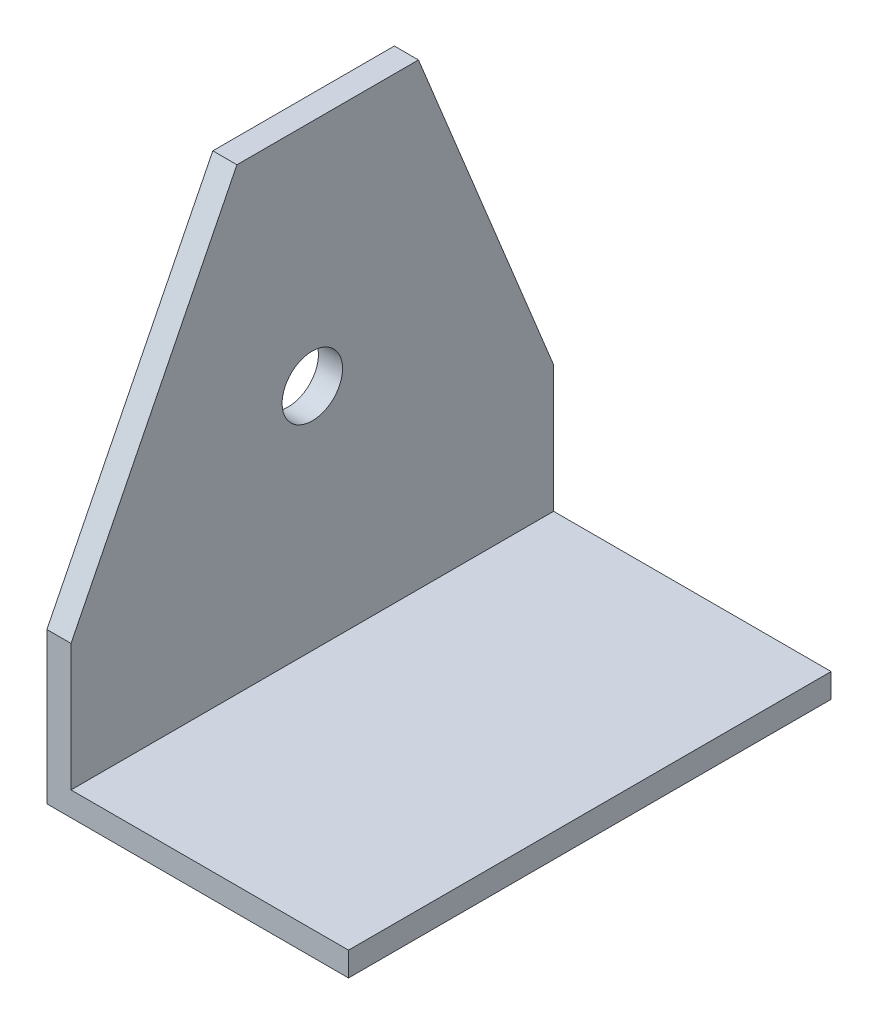
ISO-10303-21;
HEADER;
FILE_DESCRIPTION(('STEP AP214'),'2;1');
FILE_NAME('part.step','',(''),(''),'','','');
FILE_SCHEMA(('AUTOMOTIVE_DESIGN { 1 0 10303 214 1 1 1 1 }'));
ENDSEC;
DATA;
#1=APPLICATION_CONTEXT('core data for automotive mechanical design processes');
#2=APPLICATION_PROTOCOL_DEFINITION('international standard','automotive_design',2000,#1);
#3=PRODUCT_CONTEXT('',#1,'mechanical');
#4=PRODUCT('Part','Part','',(#3));
#5=PRODUCT_RELATED_PRODUCT_CATEGORY('part','',(#4));
#6=PRODUCT_DEFINITION_FORMATION('','',#4);
#7=PRODUCT_DEFINITION_CONTEXT('part definition',#1,'design');
#8=PRODUCT_DEFINITION('design','',#6,#7);
#9=PRODUCT_DEFINITION_SHAPE('','',#8);
#10=(LENGTH_UNIT() NAMED_UNIT(*) SI_UNIT(.MILLI.,.METRE.));
#11=(NAMED_UNIT(*) PLANE_ANGLE_UNIT() SI_UNIT($,.RADIAN.));
#12=(NAMED_UNIT(*) SI_UNIT($,.STERADIAN.) SOLID_ANGLE_UNIT());
#13=UNCERTAINTY_MEASURE_WITH_UNIT(LENGTH_MEASURE(1.E-05),#10,'distance_accuracy_value','');
#14=(GEOMETRIC_REPRESENTATION_CONTEXT(3) GLOBAL_UNCERTAINTY_ASSIGNED_CONTEXT((#13)) GLOBAL_UNIT_ASSIGNED_CONTEXT((#10,
#11,#12)) REPRESENTATION_CONTEXT('',''));
#15=CARTESIAN_POINT('',(0.,0.,0.));
#16=DIRECTION('',(0.,0.,1.));
#17=DIRECTION('',(1.,0.,0.));
#18=AXIS2_PLACEMENT_3D('',#15,#16,#17);
#19=CARTESIAN_POINT('',(-38.9135225375626,50.6999999999999,80.));
#20=DIRECTION('',(0.,-1.,0.));
#21=DIRECTION('',(0.,0.,-1.));
#22=AXIS2_PLACEMENT_3D('',#19,#20,#21);
#23=PLANE('',#22);
#24=DIRECTION('',(0.,0.,-1.));
#25=VECTOR('',#24,1.);
#26=CARTESIAN_POINT('',(-38.9135225375626,50.6999999999999,80.));
#27=LINE('',#26,#25);
#28=CARTESIAN_POINT('',(-38.9135225375626,50.6999999999999,52.4980270810016));
#29=VERTEX_POINT('',#28);
#30=CARTESIAN_POINT('',(-38.9135225375626,50.6999999999999,22.4007373757324));
#31=VERTEX_POINT('',#30);
#32=EDGE_CURVE('E114',#29,#31,#27,.T.);
#33=ORIENTED_EDGE('',*,*,#32,.T.);
#34=DIRECTION('',(1.,0.,0.));
#35=VECTOR('',#34,1.);
#36=CARTESIAN_POINT('',(-80.,50.6999999999999,22.4007373757324));
#37=LINE('',#36,#35);
#38=CARTESIAN_POINT('',(-42.9135225375626,50.6999999999999,22.4007373757324));
#39=VERTEX_POINT('',#38);
#40=EDGE_CURVE('E102',#39,#31,#37,.T.);
#41=ORIENTED_EDGE('',*,*,#40,.F.);
#42=DIRECTION('',(0.,0.,-1.));
#43=VECTOR('',#42,1.);
#44=CARTESIAN_POINT('',(-42.9135225375626,50.6999999999999,80.));
#45=LINE('',#44,#43);
#46=CARTESIAN_POINT('',(-42.9135225375626,50.6999999999999,52.4980270810016));
#47=VERTEX_POINT('',#46);
#48=EDGE_CURVE('E112',#47,#39,#45,.T.);
#49=ORIENTED_EDGE('',*,*,#48,.F.);
#50=DIRECTION('',(1.,0.,0.));
#51=VECTOR('',#50,1.);
#52=CARTESIAN_POINT('',(-80.,50.6999999999999,52.4980270810016));
#53=LINE('',#52,#51);
#54=EDGE_CURVE('E106',#47,#29,#53,.T.);
#55=ORIENTED_EDGE('',*,*,#54,.T.);
#56=EDGE_LOOP('',(#33,#41,#49,#55));
#57=FACE_BOUND('',#56,.T.);
#58=ADVANCED_FACE('F38',(#57),#23,.F.);
#59=CARTESIAN_POINT('',(-42.9135225375626,50.6999999999999,80.));
#60=DIRECTION('',(1.,0.,0.));
#61=DIRECTION('',(0.,0.,-1.));
#62=AXIS2_PLACEMENT_3D('',#59,#60,#61);
#63=PLANE('',#62);
#64=CARTESIAN_POINT('',(-42.9135225375626,12.6999999999999,40.));
#65=DIRECTION('',(1.,0.,0.));
#66=DIRECTION('',(0.,0.,-1.));
#67=AXIS2_PLACEMENT_3D('',#64,#65,#66);
#68=CIRCLE('',#67,5.0115);
#69=CARTESIAN_POINT('',(-42.9135225375626,12.6999999999999,34.9885));
#70=VERTEX_POINT('',#69);
#71=EDGE_CURVE('E146',#70,#70,#68,.T.);
#72=ORIENTED_EDGE('',*,*,#71,.T.);
#73=EDGE_LOOP('',(#72));
#74=FACE_BOUND('',#73,.T.);
#75=ORIENTED_EDGE('',*,*,#48,.T.);
#76=DIRECTION('',(0.,-0.926052875939042,-0.377393787660885));
#77=VECTOR('',#76,1.);
#78=CARTESIAN_POINT('',(-42.9135225375626,70.8301705967342,30.6043740417897));
#79=LINE('',#78,#77);
#80=CARTESIAN_POINT('',(-42.9135225375626,-4.26716678492981,0.));
#81=VERTEX_POINT('',#80);
#82=EDGE_CURVE('E99',#39,#81,#79,.T.);
#83=ORIENTED_EDGE('',*,*,#82,.T.);
#84=DIRECTION('',(0.,-1.,0.));
#85=VECTOR('',#84,1.);
#86=CARTESIAN_POINT('',(-42.9135225375626,50.6999999999999,0.));
#87=LINE('',#86,#85);
#88=CARTESIAN_POINT('',(-42.9135225375626,-29.3000000000001,0.));
#89=VERTEX_POINT('',#88);
#90=EDGE_CURVE('E144',#81,#89,#87,.T.);
#91=ORIENTED_EDGE('',*,*,#90,.T.);
#92=DIRECTION('',(0.,0.,-1.));
#93=VECTOR('',#92,1.);
#94=CARTESIAN_POINT('',(-42.9135225375626,-29.3000000000001,80.));
#95=LINE('',#94,#93);
#96=CARTESIAN_POINT('',(-42.9135225375626,-29.3000000000001,80.));
#97=VERTEX_POINT('',#96);
#98=EDGE_CURVE('E118',#97,#89,#95,.T.);
#99=ORIENTED_EDGE('',*,*,#98,.F.);
#100=DIRECTION('',(0.,-1.,0.));
#101=VECTOR('',#100,1.);
#102=CARTESIAN_POINT('',(-42.9135225375626,50.6999999999999,80.));
#103=LINE('',#102,#101);
#104=CARTESIAN_POINT('',(-42.9135225375626,-4.26716678492981,80.));
#105=VERTEX_POINT('',#104);
#106=EDGE_CURVE('E137',#105,#97,#103,.T.);
#107=ORIENTED_EDGE('',*,*,#106,.F.);
#108=DIRECTION('',(0.,0.894307481048207,-0.447452935336457));
#109=VECTOR('',#108,1.);
#110=CARTESIAN_POINT('',(-42.9135225375626,39.6947965598021,58.0043106441445));
#111=LINE('',#110,#109);
#112=EDGE_CURVE('E59',#105,#47,#111,.T.);
#113=ORIENTED_EDGE('',*,*,#112,.T.);
#114=EDGE_LOOP('',(#75,#83,#91,#99,#107,#113));
#115=FACE_BOUND('',#114,.T.);
#116=ADVANCED_FACE('F116',(#74,#115),#63,.F.);
#117=CARTESIAN_POINT('',(-42.9135225375626,-29.3000000000001,80.));
#118=DIRECTION('',(0.,1.,0.));
#119=DIRECTION('',(0.,0.,1.));
#120=AXIS2_PLACEMENT_3D('',#117,#118,#119);
#121=PLANE('',#120);
#122=DIRECTION('',(1.,0.,0.));
#123=VECTOR('',#122,1.);
#124=CARTESIAN_POINT('',(-42.9135225375626,-29.3000000000001,0.));
#125=LINE('',#124,#123);
#126=CARTESIAN_POINT('',(7.08647746243741,-29.3000000000001,0.));
#127=VERTEX_POINT('',#126);
#128=EDGE_CURVE('E142',#89,#127,#125,.T.);
#129=ORIENTED_EDGE('',*,*,#128,.T.);
#130=DIRECTION('',(0.,0.,-1.));
#131=VECTOR('',#130,1.);
#132=CARTESIAN_POINT('',(7.08647746243741,-29.3000000000001,80.));
#133=LINE('',#132,#131);
#134=CARTESIAN_POINT('',(7.08647746243741,-29.3000000000001,80.));
#135=VERTEX_POINT('',#134);
#136=EDGE_CURVE('E121',#135,#127,#133,.T.);
#137=ORIENTED_EDGE('',*,*,#136,.F.);
#138=DIRECTION('',(1.,0.,0.));
#139=VECTOR('',#138,1.);
#140=CARTESIAN_POINT('',(-42.9135225375626,-29.3000000000001,80.));
#141=LINE('',#140,#139);
#142=EDGE_CURVE('E153',#97,#135,#141,.T.);
#143=ORIENTED_EDGE('',*,*,#142,.F.);
#144=ORIENTED_EDGE('',*,*,#98,.T.);
#145=EDGE_LOOP('',(#129,#137,#143,#144));
#146=FACE_BOUND('',#145,.T.);
#147=ADVANCED_FACE('F179',(#146),#121,.F.);
#148=CARTESIAN_POINT('',(7.08647746243741,-29.3000000000001,80.));
#149=DIRECTION('',(-1.,0.,0.));
#150=DIRECTION('',(0.,0.,1.));
#151=AXIS2_PLACEMENT_3D('',#148,#149,#150);
#152=PLANE('',#151);
#153=DIRECTION('',(0.,1.,0.));
#154=VECTOR('',#153,1.);
#155=CARTESIAN_POINT('',(7.08647746243741,-29.3000000000001,0.));
#156=LINE('',#155,#154);
#157=CARTESIAN_POINT('',(7.08647746243741,-25.3000000000001,0.));
#158=VERTEX_POINT('',#157);
#159=EDGE_CURVE('E140',#127,#158,#156,.T.);
#160=ORIENTED_EDGE('',*,*,#159,.T.);
#161=DIRECTION('',(0.,0.,-1.));
#162=VECTOR('',#161,1.);
#163=CARTESIAN_POINT('',(7.08647746243741,-25.3000000000001,80.));
#164=LINE('',#163,#162);
#165=CARTESIAN_POINT('',(7.08647746243741,-25.3000000000001,80.));
#166=VERTEX_POINT('',#165);
#167=EDGE_CURVE('E126',#166,#158,#164,.T.);
#168=ORIENTED_EDGE('',*,*,#167,.F.);
#169=DIRECTION('',(0.,1.,0.));
#170=VECTOR('',#169,1.);
#171=CARTESIAN_POINT('',(7.08647746243741,-29.3000000000001,80.));
#172=LINE('',#171,#170);
#173=EDGE_CURVE('E151',#135,#166,#172,.T.);
#174=ORIENTED_EDGE('',*,*,#173,.F.);
#175=ORIENTED_EDGE('',*,*,#136,.T.);
#176=EDGE_LOOP('',(#160,#168,#174,#175));
#177=FACE_BOUND('',#176,.T.);
#178=ADVANCED_FACE('F204',(#177),#152,.F.);
#179=CARTESIAN_POINT('',(7.08647746243741,-25.3000000000001,80.));
#180=DIRECTION('',(0.,-1.,0.));
#181=DIRECTION('',(1.,0.,0.));
#182=AXIS2_PLACEMENT_3D('',#179,#180,#181);
#183=PLANE('',#182);
#184=DIRECTION('',(-1.,0.,0.));
#185=VECTOR('',#184,1.);
#186=CARTESIAN_POINT('',(7.08647746243741,-25.3000000000001,0.));
#187=LINE('',#186,#185);
#188=CARTESIAN_POINT('',(-38.9135225375626,-25.3000000000001,0.));
#189=VERTEX_POINT('',#188);
#190=EDGE_CURVE('E138',#158,#189,#187,.T.);
#191=ORIENTED_EDGE('',*,*,#190,.T.);
#192=DIRECTION('',(0.,0.,-1.));
#193=VECTOR('',#192,1.);
#194=CARTESIAN_POINT('',(-38.9135225375626,-25.3000000000001,80.));
#195=LINE('',#194,#193);
#196=CARTESIAN_POINT('',(-38.9135225375626,-25.3000000000001,80.));
#197=VERTEX_POINT('',#196);
#198=EDGE_CURVE('E129',#197,#189,#195,.T.);
#199=ORIENTED_EDGE('',*,*,#198,.F.);
#200=DIRECTION('',(-1.,0.,0.));
#201=VECTOR('',#200,1.);
#202=CARTESIAN_POINT('',(7.08647746243741,-25.3000000000001,80.));
#203=LINE('',#202,#201);
#204=EDGE_CURVE('E149',#166,#197,#203,.T.);
#205=ORIENTED_EDGE('',*,*,#204,.F.);
#206=ORIENTED_EDGE('',*,*,#167,.T.);
#207=EDGE_LOOP('',(#191,#199,#205,#206));
#208=FACE_BOUND('',#207,.T.);
#209=ADVANCED_FACE('F209',(#208),#183,.F.);
#210=CARTESIAN_POINT('',(-38.9135225375626,-25.3000000000001,80.));
#211=DIRECTION('',(-1.,0.,0.));
#212=DIRECTION('',(0.,-1.,0.));
#213=AXIS2_PLACEMENT_3D('',#210,#211,#212);
#214=PLANE('',#213);
#215=CARTESIAN_POINT('',(-38.9135225375626,12.6999999999999,40.));
#216=DIRECTION('',(1.,0.,0.));
#217=DIRECTION('',(0.,1.,0.));
#218=AXIS2_PLACEMENT_3D('',#215,#216,#217);
#219=CIRCLE('',#218,5.0115);
#220=CARTESIAN_POINT('',(-38.9135225375626,17.7114999999999,40.));
#221=VERTEX_POINT('',#220);
#222=EDGE_CURVE('E158',#221,#221,#219,.T.);
#223=ORIENTED_EDGE('',*,*,#222,.F.);
#224=EDGE_LOOP('',(#223));
#225=FACE_BOUND('',#224,.T.);
#226=DIRECTION('',(0.,1.,0.));
#227=VECTOR('',#226,1.);
#228=CARTESIAN_POINT('',(-38.9135225375626,-25.3000000000001,0.));
#229=LINE('',#228,#227);
#230=CARTESIAN_POINT('',(-38.9135225375626,-4.26716678492981,0.));
#231=VERTEX_POINT('',#230);
#232=EDGE_CURVE('E134',#189,#231,#229,.T.);
#233=ORIENTED_EDGE('',*,*,#232,.T.);
#234=DIRECTION('',(0.,0.926052875939042,0.377393787660885));
#235=VECTOR('',#234,1.);
#236=CARTESIAN_POINT('',(-38.9135225375626,5.65455199007641,4.04339225749802));
#237=LINE('',#236,#235);
#238=EDGE_CURVE('E52',#231,#31,#237,.T.);
#239=ORIENTED_EDGE('',*,*,#238,.T.);
#240=ORIENTED_EDGE('',*,*,#32,.F.);
#241=DIRECTION('',(0.,-0.894307481048207,0.447452935336457));
#242=VECTOR('',#241,1.);
#243=CARTESIAN_POINT('',(-38.9135225375626,-21.0889296102659,88.4165092132608));
#244=LINE('',#243,#242);
#245=CARTESIAN_POINT('',(-38.9135225375626,-4.26716678492981,80.));
#246=VERTEX_POINT('',#245);
#247=EDGE_CURVE('E162',#29,#246,#244,.T.);
#248=ORIENTED_EDGE('',*,*,#247,.T.);
#249=DIRECTION('',(0.,1.,0.));
#250=VECTOR('',#249,1.);
#251=CARTESIAN_POINT('',(-38.9135225375626,-25.3000000000001,80.));
#252=LINE('',#251,#250);
#253=EDGE_CURVE('E133',#197,#246,#252,.T.);
#254=ORIENTED_EDGE('',*,*,#253,.F.);
#255=ORIENTED_EDGE('',*,*,#198,.T.);
#256=EDGE_LOOP('',(#233,#239,#240,#248,#254,#255));
#257=FACE_BOUND('',#256,.T.);
#258=ADVANCED_FACE('F167',(#225,#257),#214,.F.);
#259=CARTESIAN_POINT('',(0.,0.,80.));
#260=DIRECTION('',(0.,0.,1.));
#261=DIRECTION('',(1.,0.,0.));
#262=AXIS2_PLACEMENT_3D('',#259,#260,#261);
#263=PLANE('',#262);
#264=DIRECTION('',(1.,0.,0.));
#265=VECTOR('',#264,1.);
#266=CARTESIAN_POINT('',(0.,-4.26716678492981,80.));
#267=LINE('',#266,#265);
#268=EDGE_CURVE('E45',#105,#246,#267,.T.);
#269=ORIENTED_EDGE('',*,*,#268,.F.);
#270=ORIENTED_EDGE('',*,*,#106,.T.);
#271=ORIENTED_EDGE('',*,*,#142,.T.);
#272=ORIENTED_EDGE('',*,*,#173,.T.);
#273=ORIENTED_EDGE('',*,*,#204,.T.);
#274=ORIENTED_EDGE('',*,*,#253,.T.);
#275=EDGE_LOOP('',(#269,#270,#271,#272,#273,#274));
#276=FACE_BOUND('',#275,.T.);
#277=ADVANCED_FACE('F183',(#276),#263,.T.);
#278=CARTESIAN_POINT('',(0.,0.,0.));
#279=DIRECTION('',(0.,0.,1.));
#280=DIRECTION('',(1.,0.,0.));
#281=AXIS2_PLACEMENT_3D('',#278,#279,#280);
#282=PLANE('',#281);
#283=ORIENTED_EDGE('',*,*,#90,.F.);
#284=DIRECTION('',(1.,0.,0.));
#285=VECTOR('',#284,1.);
#286=CARTESIAN_POINT('',(0.,-4.26716678492981,0.));
#287=LINE('',#286,#285);
#288=EDGE_CURVE('E11',#81,#231,#287,.T.);
#289=ORIENTED_EDGE('',*,*,#288,.T.);
#290=ORIENTED_EDGE('',*,*,#232,.F.);
#291=ORIENTED_EDGE('',*,*,#190,.F.);
#292=ORIENTED_EDGE('',*,*,#159,.F.);
#293=ORIENTED_EDGE('',*,*,#128,.F.);
#294=EDGE_LOOP('',(#283,#289,#290,#291,#292,#293));
#295=FACE_BOUND('',#294,.T.);
#296=ADVANCED_FACE('F173',(#295),#282,.F.);
#297=CARTESIAN_POINT('',(-118.913522537563,12.7,40.));
#298=DIRECTION('',(1.,0.,0.));
#299=DIRECTION('',(0.,1.,0.));
#300=AXIS2_PLACEMENT_3D('',#297,#298,#299);
#301=CYLINDRICAL_SURFACE('',#300,5.0115);
#302=ORIENTED_EDGE('',*,*,#222,.T.);
#303=EDGE_LOOP('',(#302));
#304=FACE_BOUND('',#303,.T.);
#305=ORIENTED_EDGE('',*,*,#71,.F.);
#306=EDGE_LOOP('',(#305));
#307=FACE_BOUND('',#306,.T.);
#308=ADVANCED_FACE('F187',(#304,#307),#301,.F.);
#309=CARTESIAN_POINT('',(-80.,-4.26716678492981,80.));
#310=DIRECTION('',(0.,-0.447452935336457,-0.894307481048207));
#311=DIRECTION('',(0.,0.894307481048207,-0.447452935336457));
#312=AXIS2_PLACEMENT_3D('',#309,#310,#311);
#313=PLANE('',#312);
#314=ORIENTED_EDGE('',*,*,#268,.T.);
#315=ORIENTED_EDGE('',*,*,#247,.F.);
#316=ORIENTED_EDGE('',*,*,#54,.F.);
#317=ORIENTED_EDGE('',*,*,#112,.F.);
#318=EDGE_LOOP('',(#314,#315,#316,#317));
#319=FACE_BOUND('',#318,.T.);
#320=ADVANCED_FACE('F185',(#319),#313,.F.);
#321=CARTESIAN_POINT('',(-80.,-4.26716678492981,0.));
#322=DIRECTION('',(0.,-0.377393787660885,0.926052875939042));
#323=DIRECTION('',(0.,-0.926052875939042,-0.377393787660885));
#324=AXIS2_PLACEMENT_3D('',#321,#322,#323);
#325=PLANE('',#324);
#326=ORIENTED_EDGE('',*,*,#40,.T.);
#327=ORIENTED_EDGE('',*,*,#238,.F.);
#328=ORIENTED_EDGE('',*,*,#288,.F.);
#329=ORIENTED_EDGE('',*,*,#82,.F.);
#330=EDGE_LOOP('',(#326,#327,#328,#329));
#331=FACE_BOUND('',#330,.T.);
#332=ADVANCED_FACE('F101',(#331),#325,.F.);
#333=CLOSED_SHELL('',(#58,#116,#147,#178,#209,#258,#277,#296,#308,#320,#332));
#334=MANIFOLD_SOLID_BREP('B2',#333);
#335=ADVANCED_BREP_SHAPE_REPRESENTATION('',(#18,#334),#14);
#336=SHAPE_DEFINITION_REPRESENTATION(#9,#335);
ENDSEC;
END-ISO-10303-21;
